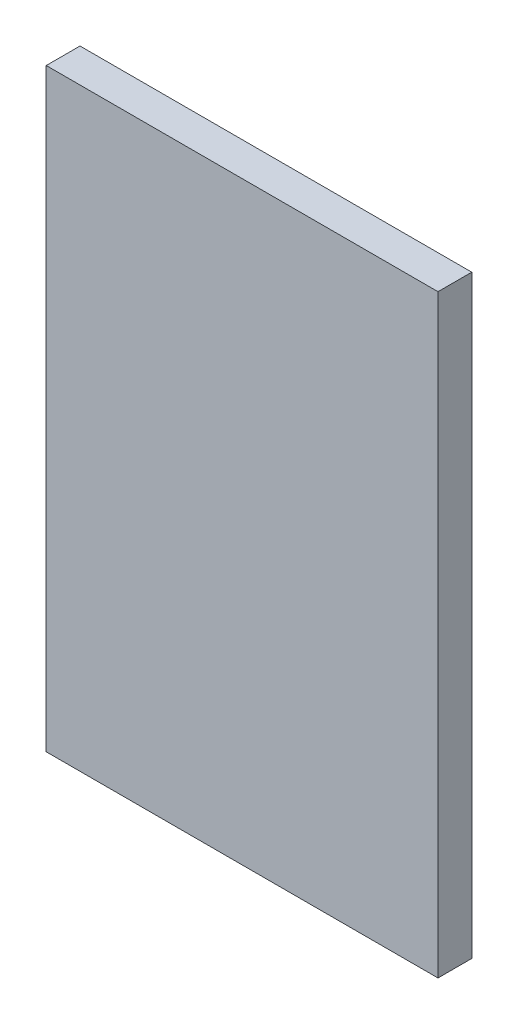
ISO-10303-21;
HEADER;
FILE_DESCRIPTION(('STEP AP214'),'2;1');
FILE_NAME('part.step','',(''),(''),'','','');
FILE_SCHEMA(('AUTOMOTIVE_DESIGN { 1 0 10303 214 1 1 1 1 }'));
ENDSEC;
DATA;
#1=APPLICATION_CONTEXT('core data for automotive mechanical design processes');
#2=APPLICATION_PROTOCOL_DEFINITION('international standard','automotive_design',2000,#1);
#3=PRODUCT_CONTEXT('',#1,'mechanical');
#4=PRODUCT('Part','Part','',(#3));
#5=PRODUCT_RELATED_PRODUCT_CATEGORY('part','',(#4));
#6=PRODUCT_DEFINITION_FORMATION('','',#4);
#7=PRODUCT_DEFINITION_CONTEXT('part definition',#1,'design');
#8=PRODUCT_DEFINITION('design','',#6,#7);
#9=PRODUCT_DEFINITION_SHAPE('','',#8);
#10=(LENGTH_UNIT() NAMED_UNIT(*) SI_UNIT(.MILLI.,.METRE.));
#11=(NAMED_UNIT(*) PLANE_ANGLE_UNIT() SI_UNIT($,.RADIAN.));
#12=(NAMED_UNIT(*) SI_UNIT($,.STERADIAN.) SOLID_ANGLE_UNIT());
#13=UNCERTAINTY_MEASURE_WITH_UNIT(LENGTH_MEASURE(1.E-05),#10,'distance_accuracy_value','');
#14=(GEOMETRIC_REPRESENTATION_CONTEXT(3) GLOBAL_UNCERTAINTY_ASSIGNED_CONTEXT((#13)) GLOBAL_UNIT_ASSIGNED_CONTEXT((#10,
#11,#12)) REPRESENTATION_CONTEXT('',''));
#15=CARTESIAN_POINT('',(0.,0.,0.));
#16=DIRECTION('',(0.,0.,1.));
#17=DIRECTION('',(1.,0.,0.));
#18=AXIS2_PLACEMENT_3D('',#15,#16,#17);
#19=CARTESIAN_POINT('',(0.,0.,5.));
#20=DIRECTION('',(0.,1.,0.));
#21=DIRECTION('',(0.,0.,1.));
#22=AXIS2_PLACEMENT_3D('',#19,#20,#21);
#23=PLANE('',#22);
#24=DIRECTION('',(1.,0.,0.));
#25=VECTOR('',#24,1.);
#26=CARTESIAN_POINT('',(0.,0.,0.));
#27=LINE('',#26,#25);
#28=CARTESIAN_POINT('',(-58.,0.,0.));
#29=VERTEX_POINT('',#28);
#30=CARTESIAN_POINT('',(0.,0.,0.));
#31=VERTEX_POINT('',#30);
#32=EDGE_CURVE('E113',#29,#31,#27,.T.);
#33=ORIENTED_EDGE('',*,*,#32,.T.);
#34=DIRECTION('',(0.,0.,-1.));
#35=VECTOR('',#34,1.);
#36=CARTESIAN_POINT('',(0.,0.,5.));
#37=LINE('',#36,#35);
#38=CARTESIAN_POINT('',(0.,0.,5.));
#39=VERTEX_POINT('',#38);
#40=EDGE_CURVE('E11',#39,#31,#37,.T.);
#41=ORIENTED_EDGE('',*,*,#40,.F.);
#42=DIRECTION('',(1.,0.,0.));
#43=VECTOR('',#42,1.);
#44=CARTESIAN_POINT('',(0.,0.,5.));
#45=LINE('',#44,#43);
#46=CARTESIAN_POINT('',(-58.,0.,5.));
#47=VERTEX_POINT('',#46);
#48=EDGE_CURVE('E97',#47,#39,#45,.T.);
#49=ORIENTED_EDGE('',*,*,#48,.F.);
#50=DIRECTION('',(0.,0.,-1.));
#51=VECTOR('',#50,1.);
#52=CARTESIAN_POINT('',(-58.,0.,5.));
#53=LINE('',#52,#51);
#54=EDGE_CURVE('E109',#47,#29,#53,.T.);
#55=ORIENTED_EDGE('',*,*,#54,.T.);
#56=EDGE_LOOP('',(#33,#41,#49,#55));
#57=FACE_BOUND('',#56,.T.);
#58=ADVANCED_FACE('F45',(#57),#23,.F.);
#59=CARTESIAN_POINT('',(0.,0.,5.));
#60=DIRECTION('',(-1.,0.,0.));
#61=DIRECTION('',(0.,0.,1.));
#62=AXIS2_PLACEMENT_3D('',#59,#60,#61);
#63=PLANE('',#62);
#64=DIRECTION('',(0.,1.,0.));
#65=VECTOR('',#64,1.);
#66=CARTESIAN_POINT('',(0.,0.,0.));
#67=LINE('',#66,#65);
#68=CARTESIAN_POINT('',(0.,88.,0.));
#69=VERTEX_POINT('',#68);
#70=EDGE_CURVE('E102',#31,#69,#67,.T.);
#71=ORIENTED_EDGE('',*,*,#70,.T.);
#72=DIRECTION('',(0.,0.,-1.));
#73=VECTOR('',#72,1.);
#74=CARTESIAN_POINT('',(0.,88.,5.));
#75=LINE('',#74,#73);
#76=CARTESIAN_POINT('',(0.,88.,5.));
#77=VERTEX_POINT('',#76);
#78=EDGE_CURVE('E54',#77,#69,#75,.T.);
#79=ORIENTED_EDGE('',*,*,#78,.F.);
#80=DIRECTION('',(0.,1.,0.));
#81=VECTOR('',#80,1.);
#82=CARTESIAN_POINT('',(0.,0.,5.));
#83=LINE('',#82,#81);
#84=EDGE_CURVE('E92',#39,#77,#83,.T.);
#85=ORIENTED_EDGE('',*,*,#84,.F.);
#86=ORIENTED_EDGE('',*,*,#40,.T.);
#87=EDGE_LOOP('',(#71,#79,#85,#86));
#88=FACE_BOUND('',#87,.T.);
#89=ADVANCED_FACE('F101',(#88),#63,.F.);
#90=CARTESIAN_POINT('',(0.,88.,5.));
#91=DIRECTION('',(0.,-1.,0.));
#92=DIRECTION('',(0.,0.,-1.));
#93=AXIS2_PLACEMENT_3D('',#90,#91,#92);
#94=PLANE('',#93);
#95=DIRECTION('',(-1.,0.,0.));
#96=VECTOR('',#95,1.);
#97=CARTESIAN_POINT('',(0.,88.,0.));
#98=LINE('',#97,#96);
#99=CARTESIAN_POINT('',(-58.,88.,0.));
#100=VERTEX_POINT('',#99);
#101=EDGE_CURVE('E79',#69,#100,#98,.T.);
#102=ORIENTED_EDGE('',*,*,#101,.T.);
#103=DIRECTION('',(0.,0.,-1.));
#104=VECTOR('',#103,1.);
#105=CARTESIAN_POINT('',(-58.,88.,5.));
#106=LINE('',#105,#104);
#107=CARTESIAN_POINT('',(-58.,88.,5.));
#108=VERTEX_POINT('',#107);
#109=EDGE_CURVE('E104',#108,#100,#106,.T.);
#110=ORIENTED_EDGE('',*,*,#109,.F.);
#111=DIRECTION('',(-1.,0.,0.));
#112=VECTOR('',#111,1.);
#113=CARTESIAN_POINT('',(0.,88.,5.));
#114=LINE('',#113,#112);
#115=EDGE_CURVE('E95',#77,#108,#114,.T.);
#116=ORIENTED_EDGE('',*,*,#115,.F.);
#117=ORIENTED_EDGE('',*,*,#78,.T.);
#118=EDGE_LOOP('',(#102,#110,#116,#117));
#119=FACE_BOUND('',#118,.T.);
#120=ADVANCED_FACE('F105',(#119),#94,.F.);
#121=CARTESIAN_POINT('',(-58.,0.,5.));
#122=DIRECTION('',(1.,0.,0.));
#123=DIRECTION('',(0.,0.,-1.));
#124=AXIS2_PLACEMENT_3D('',#121,#122,#123);
#125=PLANE('',#124);
#126=DIRECTION('',(0.,-1.,0.));
#127=VECTOR('',#126,1.);
#128=CARTESIAN_POINT('',(-58.,0.,0.));
#129=LINE('',#128,#127);
#130=EDGE_CURVE('E85',#100,#29,#129,.T.);
#131=ORIENTED_EDGE('',*,*,#130,.T.);
#132=ORIENTED_EDGE('',*,*,#54,.F.);
#133=DIRECTION('',(0.,-1.,0.));
#134=VECTOR('',#133,1.);
#135=CARTESIAN_POINT('',(-58.,0.,5.));
#136=LINE('',#135,#134);
#137=EDGE_CURVE('E62',#108,#47,#136,.T.);
#138=ORIENTED_EDGE('',*,*,#137,.F.);
#139=ORIENTED_EDGE('',*,*,#109,.T.);
#140=EDGE_LOOP('',(#131,#132,#138,#139));
#141=FACE_BOUND('',#140,.T.);
#142=ADVANCED_FACE('F126',(#141),#125,.F.);
#143=CARTESIAN_POINT('',(0.,0.,5.));
#144=DIRECTION('',(0.,0.,-1.));
#145=DIRECTION('',(-1.,0.,0.));
#146=AXIS2_PLACEMENT_3D('',#143,#144,#145);
#147=PLANE('',#146);
#148=ORIENTED_EDGE('',*,*,#48,.T.);
#149=ORIENTED_EDGE('',*,*,#84,.T.);
#150=ORIENTED_EDGE('',*,*,#115,.T.);
#151=ORIENTED_EDGE('',*,*,#137,.T.);
#152=EDGE_LOOP('',(#148,#149,#150,#151));
#153=FACE_BOUND('',#152,.T.);
#154=ADVANCED_FACE('F93',(#153),#147,.F.);
#155=CARTESIAN_POINT('',(0.,0.,0.));
#156=DIRECTION('',(0.,0.,-1.));
#157=DIRECTION('',(-1.,0.,0.));
#158=AXIS2_PLACEMENT_3D('',#155,#156,#157);
#159=PLANE('',#158);
#160=ORIENTED_EDGE('',*,*,#32,.F.);
#161=ORIENTED_EDGE('',*,*,#130,.F.);
#162=ORIENTED_EDGE('',*,*,#101,.F.);
#163=ORIENTED_EDGE('',*,*,#70,.F.);
#164=EDGE_LOOP('',(#160,#161,#162,#163));
#165=FACE_BOUND('',#164,.T.);
#166=ADVANCED_FACE('F129',(#165),#159,.T.);
#167=CLOSED_SHELL('',(#58,#89,#120,#142,#154,#166));
#168=MANIFOLD_SOLID_BREP('B2',#167);
#169=ADVANCED_BREP_SHAPE_REPRESENTATION('',(#18,#168),#14);
#170=SHAPE_DEFINITION_REPRESENTATION(#9,#169);
ENDSEC;
END-ISO-10303-21;
